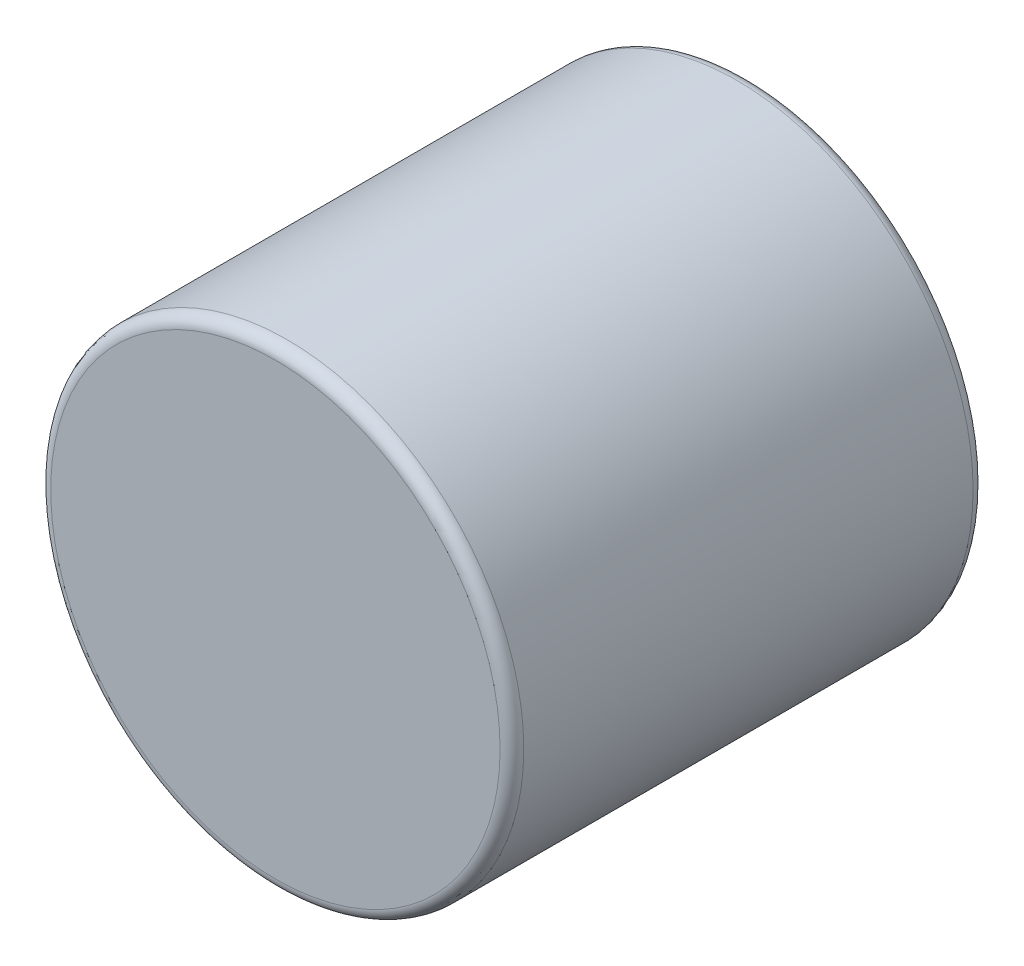
ISO-10303-21;
HEADER;
FILE_DESCRIPTION(('STEP AP214'),'2;1');
FILE_NAME('part.step','',(''),(''),'','','');
FILE_SCHEMA(('AUTOMOTIVE_DESIGN { 1 0 10303 214 1 1 1 1 }'));
ENDSEC;
DATA;
#1=APPLICATION_CONTEXT('core data for automotive mechanical design processes');
#2=APPLICATION_PROTOCOL_DEFINITION('international standard','automotive_design',2000,#1);
#3=PRODUCT_CONTEXT('',#1,'mechanical');
#4=PRODUCT('Part','Part','',(#3));
#5=PRODUCT_RELATED_PRODUCT_CATEGORY('part','',(#4));
#6=PRODUCT_DEFINITION_FORMATION('','',#4);
#7=PRODUCT_DEFINITION_CONTEXT('part definition',#1,'design');
#8=PRODUCT_DEFINITION('design','',#6,#7);
#9=PRODUCT_DEFINITION_SHAPE('','',#8);
#10=(LENGTH_UNIT() NAMED_UNIT(*) SI_UNIT(.MILLI.,.METRE.));
#11=(NAMED_UNIT(*) PLANE_ANGLE_UNIT() SI_UNIT($,.RADIAN.));
#12=(NAMED_UNIT(*) SI_UNIT($,.STERADIAN.) SOLID_ANGLE_UNIT());
#13=UNCERTAINTY_MEASURE_WITH_UNIT(LENGTH_MEASURE(1.E-05),#10,'distance_accuracy_value','');
#14=(GEOMETRIC_REPRESENTATION_CONTEXT(3) GLOBAL_UNCERTAINTY_ASSIGNED_CONTEXT((#13)) GLOBAL_UNIT_ASSIGNED_CONTEXT((#10,
#11,#12)) REPRESENTATION_CONTEXT('',''));
#15=CARTESIAN_POINT('',(0.,0.,0.));
#16=DIRECTION('',(0.,0.,1.));
#17=DIRECTION('',(1.,0.,0.));
#18=AXIS2_PLACEMENT_3D('',#15,#16,#17);
#19=CARTESIAN_POINT('',(0.,0.,3.175));
#20=DIRECTION('',(0.,0.,-1.));
#21=DIRECTION('',(-1.,0.,0.));
#22=AXIS2_PLACEMENT_3D('',#19,#20,#21);
#23=CYLINDRICAL_SURFACE('',#22,3.175);
#24=CARTESIAN_POINT('',(0.,0.,-3.01625));
#25=DIRECTION('',(0.,0.,1.));
#26=DIRECTION('',(1.,0.,0.));
#27=AXIS2_PLACEMENT_3D('',#24,#25,#26);
#28=CIRCLE('',#27,3.175);
#29=CARTESIAN_POINT('',(3.175,0.,-3.01625));
#30=VERTEX_POINT('',#29);
#31=EDGE_CURVE('E41',#30,#30,#28,.T.);
#32=ORIENTED_EDGE('',*,*,#31,.T.);
#33=EDGE_LOOP('',(#32));
#34=FACE_BOUND('',#33,.T.);
#35=CARTESIAN_POINT('',(0.,0.,3.01625));
#36=DIRECTION('',(0.,0.,1.));
#37=DIRECTION('',(1.,0.,0.));
#38=AXIS2_PLACEMENT_3D('',#35,#36,#37);
#39=CIRCLE('',#38,3.175);
#40=CARTESIAN_POINT('',(3.175,0.,3.01625));
#41=VERTEX_POINT('',#40);
#42=EDGE_CURVE('E45',#41,#41,#39,.F.);
#43=ORIENTED_EDGE('',*,*,#42,.T.);
#44=EDGE_LOOP('',(#43));
#45=FACE_BOUND('',#44,.T.);
#46=ADVANCED_FACE('F30',(#34,#45),#23,.T.);
#47=CARTESIAN_POINT('',(0.,0.,3.175));
#48=DIRECTION('',(0.,0.,1.));
#49=DIRECTION('',(1.,0.,0.));
#50=AXIS2_PLACEMENT_3D('',#47,#48,#49);
#51=PLANE('',#50);
#52=CARTESIAN_POINT('',(0.,0.,3.175));
#53=DIRECTION('',(0.,0.,1.));
#54=DIRECTION('',(1.,0.,0.));
#55=AXIS2_PLACEMENT_3D('',#52,#53,#54);
#56=CIRCLE('',#55,3.01625);
#57=CARTESIAN_POINT('',(3.01625,0.,3.175));
#58=VERTEX_POINT('',#57);
#59=EDGE_CURVE('E10',#58,#58,#56,.T.);
#60=ORIENTED_EDGE('',*,*,#59,.T.);
#61=EDGE_LOOP('',(#60));
#62=FACE_BOUND('',#61,.T.);
#63=ADVANCED_FACE('F61',(#62),#51,.T.);
#64=CARTESIAN_POINT('',(0.,0.,-3.175));
#65=DIRECTION('',(0.,0.,1.));
#66=DIRECTION('',(1.,0.,0.));
#67=AXIS2_PLACEMENT_3D('',#64,#65,#66);
#68=PLANE('',#67);
#69=CARTESIAN_POINT('',(0.,0.,-3.175));
#70=DIRECTION('',(0.,0.,1.));
#71=DIRECTION('',(1.,0.,0.));
#72=AXIS2_PLACEMENT_3D('',#69,#70,#71);
#73=CIRCLE('',#72,3.01625);
#74=CARTESIAN_POINT('',(3.01625,0.,-3.175));
#75=VERTEX_POINT('',#74);
#76=EDGE_CURVE('E37',#75,#75,#73,.F.);
#77=ORIENTED_EDGE('',*,*,#76,.T.);
#78=EDGE_LOOP('',(#77));
#79=FACE_BOUND('',#78,.T.);
#80=ADVANCED_FACE('F58',(#79),#68,.F.);
#81=CARTESIAN_POINT('',(0.,0.,-3.01625));
#82=DIRECTION('',(0.,0.,1.));
#83=DIRECTION('',(1.,0.,0.));
#84=AXIS2_PLACEMENT_3D('',#81,#82,#83);
#85=TOROIDAL_SURFACE('',#84,3.01625,0.15875);
#86=ORIENTED_EDGE('',*,*,#76,.F.);
#87=EDGE_LOOP('',(#86));
#88=FACE_BOUND('',#87,.T.);
#89=ORIENTED_EDGE('',*,*,#31,.F.);
#90=EDGE_LOOP('',(#89));
#91=FACE_BOUND('',#90,.T.);
#92=ADVANCED_FACE('F54',(#88,#91),#85,.T.);
#93=CARTESIAN_POINT('',(0.,0.,3.01625));
#94=DIRECTION('',(0.,0.,1.));
#95=DIRECTION('',(1.,0.,0.));
#96=AXIS2_PLACEMENT_3D('',#93,#94,#95);
#97=TOROIDAL_SURFACE('',#96,3.01625,0.15875);
#98=ORIENTED_EDGE('',*,*,#42,.F.);
#99=EDGE_LOOP('',(#98));
#100=FACE_BOUND('',#99,.T.);
#101=ORIENTED_EDGE('',*,*,#59,.F.);
#102=EDGE_LOOP('',(#101));
#103=FACE_BOUND('',#102,.T.);
#104=ADVANCED_FACE('F32',(#100,#103),#97,.T.);
#105=CLOSED_SHELL('',(#46,#63,#80,#92,#104));
#106=MANIFOLD_SOLID_BREP('B2',#105);
#107=ADVANCED_BREP_SHAPE_REPRESENTATION('',(#18,#106),#14);
#108=SHAPE_DEFINITION_REPRESENTATION(#9,#107);
ENDSEC;
END-ISO-10303-21;
